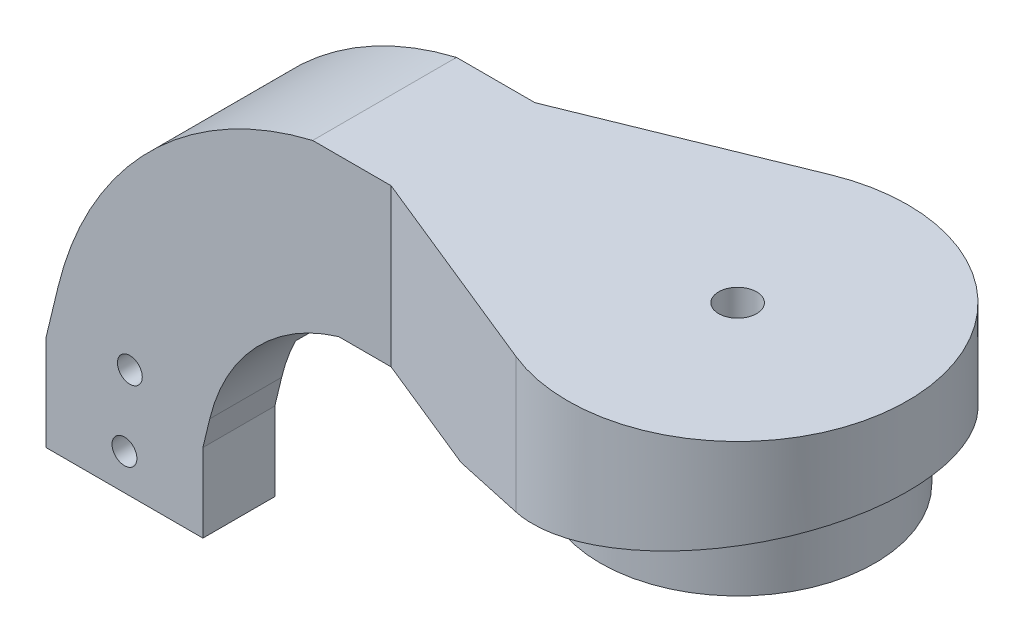
ISO-10303-21;
HEADER;
FILE_DESCRIPTION(('STEP AP214'),'2;1');
FILE_NAME('part.step','',(''),(''),'','','');
FILE_SCHEMA(('AUTOMOTIVE_DESIGN { 1 0 10303 214 1 1 1 1 }'));
ENDSEC;
DATA;
#1=APPLICATION_CONTEXT('core data for automotive mechanical design processes');
#2=APPLICATION_PROTOCOL_DEFINITION('international standard','automotive_design',2000,#1);
#3=PRODUCT_CONTEXT('',#1,'mechanical');
#4=PRODUCT('Part','Part','',(#3));
#5=PRODUCT_RELATED_PRODUCT_CATEGORY('part','',(#4));
#6=PRODUCT_DEFINITION_FORMATION('','',#4);
#7=PRODUCT_DEFINITION_CONTEXT('part definition',#1,'design');
#8=PRODUCT_DEFINITION('design','',#6,#7);
#9=PRODUCT_DEFINITION_SHAPE('','',#8);
#10=(LENGTH_UNIT() NAMED_UNIT(*) SI_UNIT(.MILLI.,.METRE.));
#11=(NAMED_UNIT(*) PLANE_ANGLE_UNIT() SI_UNIT($,.RADIAN.));
#12=(NAMED_UNIT(*) SI_UNIT($,.STERADIAN.) SOLID_ANGLE_UNIT());
#13=UNCERTAINTY_MEASURE_WITH_UNIT(LENGTH_MEASURE(1.E-05),#10,'distance_accuracy_value','');
#14=(GEOMETRIC_REPRESENTATION_CONTEXT(3) GLOBAL_UNCERTAINTY_ASSIGNED_CONTEXT((#13)) GLOBAL_UNIT_ASSIGNED_CONTEXT((#10,
#11,#12)) REPRESENTATION_CONTEXT('',''));
#15=CARTESIAN_POINT('',(0.,0.,0.));
#16=DIRECTION('',(0.,0.,1.));
#17=DIRECTION('',(1.,0.,0.));
#18=AXIS2_PLACEMENT_3D('',#15,#16,#17);
#19=CARTESIAN_POINT('',(-42.,24.,-11.));
#20=DIRECTION('',(0.376404535641537,0.,0.926455409368675));
#21=DIRECTION('',(0.,-1.,0.));
#22=AXIS2_PLACEMENT_3D('',#19,#20,#21);
#23=PLANE('',#22);
#24=DIRECTION('',(0.926455409368675,0.,-0.376404535641537));
#25=VECTOR('',#24,1.);
#26=CARTESIAN_POINT('',(-42.,0.,-11.));
#27=LINE('',#26,#25);
#28=CARTESIAN_POINT('',(-42.,0.,-11.));
#29=VERTEX_POINT('',#28);
#30=CARTESIAN_POINT('',(-24.,0.,-18.3131222215699));
#31=VERTEX_POINT('',#30);
#32=EDGE_CURVE('E433',#29,#31,#27,.T.);
#33=ORIENTED_EDGE('',*,*,#32,.F.);
#34=DIRECTION('',(0.,-1.,0.));
#35=VECTOR('',#34,1.);
#36=CARTESIAN_POINT('',(-42.,24.,-11.));
#37=LINE('',#36,#35);
#38=CARTESIAN_POINT('',(-42.,24.,-11.));
#39=VERTEX_POINT('',#38);
#40=EDGE_CURVE('E399',#39,#29,#37,.T.);
#41=ORIENTED_EDGE('',*,*,#40,.F.);
#42=DIRECTION('',(0.926455409368675,0.,-0.376404535641537));
#43=VECTOR('',#42,1.);
#44=CARTESIAN_POINT('',(-42.,24.,-11.));
#45=LINE('',#44,#43);
#46=CARTESIAN_POINT('',(-9.78651792667998,24.,-24.0878406435855));
#47=VERTEX_POINT('',#46);
#48=EDGE_CURVE('E367',#39,#47,#45,.T.);
#49=ORIENTED_EDGE('',*,*,#48,.T.);
#50=DIRECTION('',(0.,-1.,0.));
#51=VECTOR('',#50,1.);
#52=CARTESIAN_POINT('',(-9.78651792667998,24.,-24.0878406435855));
#53=LINE('',#52,#51);
#54=CARTESIAN_POINT('',(-9.78651792667998,3.41123569759681,-24.0878406435855));
#55=VERTEX_POINT('',#54);
#56=EDGE_CURVE('E59',#47,#55,#53,.T.);
#57=ORIENTED_EDGE('',*,*,#56,.T.);
#58=DIRECTION('',(0.904369439054215,0.217048665373012,-0.367431346736448));
#59=VECTOR('',#58,1.);
#60=CARTESIAN_POINT('',(-36.4410054694557,-2.98584131266939,-13.258533690606));
#61=LINE('',#60,#59);
#62=EDGE_CURVE('E330',#31,#55,#61,.T.);
#63=ORIENTED_EDGE('',*,*,#62,.F.);
#64=EDGE_LOOP('',(#33,#41,#49,#57,#63));
#65=FACE_BOUND('',#64,.T.);
#66=ADVANCED_FACE('F48',(#65),#23,.F.);
#67=CARTESIAN_POINT('',(0.,24.,0.));
#68=DIRECTION('',(0.,-1.,0.));
#69=DIRECTION('',(0.,0.,1.));
#70=AXIS2_PLACEMENT_3D('',#67,#68,#69);
#71=CYLINDRICAL_SURFACE('',#70,26.);
#72=ORIENTED_EDGE('',*,*,#56,.F.);
#73=CARTESIAN_POINT('',(0.,24.,0.));
#74=DIRECTION('',(0.,-1.,0.));
#75=DIRECTION('',(0.,0.,-1.));
#76=AXIS2_PLACEMENT_3D('',#73,#74,#75);
#77=CIRCLE('',#76,26.);
#78=CARTESIAN_POINT('',(-9.78651792667998,24.,24.0878406435855));
#79=VERTEX_POINT('',#78);
#80=EDGE_CURVE('E80',#47,#79,#77,.T.);
#81=ORIENTED_EDGE('',*,*,#80,.T.);
#82=DIRECTION('',(0.,-1.,0.));
#83=VECTOR('',#82,1.);
#84=CARTESIAN_POINT('',(-9.78651792667998,24.,24.0878406435855));
#85=LINE('',#84,#83);
#86=CARTESIAN_POINT('',(-9.78651792667997,3.41123569759681,24.0878406435855));
#87=VERTEX_POINT('',#86);
#88=EDGE_CURVE('E362',#79,#87,#85,.T.);
#89=ORIENTED_EDGE('',*,*,#88,.T.);
#90=CARTESIAN_POINT('',(0.,5.76,26.));
#91=CARTESIAN_POINT('',(-3.36549669401161,4.95228079343722,26.));
#92=CARTESIAN_POINT('',(-6.66853530930052,4.15955152576788,25.3546288638981));
#93=CARTESIAN_POINT('',(-9.78651792667997,3.41123569759681,24.0878406435855));
#94=(BOUNDED_CURVE() B_SPLINE_CURVE(3,(#90,#91,#92,#93),.UNSPECIFIED.,.F.,
.F.) B_SPLINE_CURVE_WITH_KNOTS((4,4),(4.71238898038469,5.09830132041736),
.UNSPECIFIED.) CURVE() GEOMETRIC_REPRESENTATION_ITEM() RATIONAL_B_SPLINE_CURVE((1.,
0.987627764061524,0.987627764061524,1.)) REPRESENTATION_ITEM(''));
#95=CARTESIAN_POINT('',(0.,5.76,26.));
#96=VERTEX_POINT('',#95);
#97=EDGE_CURVE('E768',#96,#87,#94,.T.);
#98=ORIENTED_EDGE('',*,*,#97,.F.);
#99=CARTESIAN_POINT('',(0.,5.76,-26.));
#100=CARTESIAN_POINT('',(52.,18.24,-26.));
#101=CARTESIAN_POINT('',(52.,18.24,26.));
#102=CARTESIAN_POINT('',(0.,5.76,26.));
#103=(BOUNDED_CURVE() B_SPLINE_CURVE(3,(#99,#100,#101,#102),.UNSPECIFIED.,.F.,
.F.) B_SPLINE_CURVE_WITH_KNOTS((4,4),(1.5707963267949,4.71238898038469),
.UNSPECIFIED.) CURVE() GEOMETRIC_REPRESENTATION_ITEM() RATIONAL_B_SPLINE_CURVE((1.,
0.333333333333334,0.333333333333334,1.)) REPRESENTATION_ITEM(''));
#104=CARTESIAN_POINT('',(0.,5.76,-26.));
#105=VERTEX_POINT('',#104);
#106=EDGE_CURVE('E52',#105,#96,#103,.T.);
#107=ORIENTED_EDGE('',*,*,#106,.F.);
#108=CARTESIAN_POINT('',(-9.78651792667998,3.41123569759681,-24.0878406435855));
#109=CARTESIAN_POINT('',(-6.66853530930053,4.15955152576788,-25.3546288638981));
#110=CARTESIAN_POINT('',(-3.36549669401162,4.95228079343722,-26.));
#111=CARTESIAN_POINT('',(0.,5.76,-26.));
#112=(BOUNDED_CURVE() B_SPLINE_CURVE(3,(#108,#109,#110,#111),.UNSPECIFIED.,.F.,
.F.) B_SPLINE_CURVE_WITH_KNOTS((4,4),(1.18488398676223,1.5707963267949),
.UNSPECIFIED.) CURVE() GEOMETRIC_REPRESENTATION_ITEM() RATIONAL_B_SPLINE_CURVE((1.,
0.987627764061524,0.987627764061524,1.)) REPRESENTATION_ITEM(''));
#113=EDGE_CURVE('E458',#55,#105,#112,.T.);
#114=ORIENTED_EDGE('',*,*,#113,.F.);
#115=EDGE_LOOP('',(#72,#81,#89,#98,#107,#114));
#116=FACE_BOUND('',#115,.T.);
#117=ADVANCED_FACE('F490',(#116),#71,.T.);
#118=CARTESIAN_POINT('',(-42.,24.,11.));
#119=DIRECTION('',(0.376404535641537,0.,-0.926455409368675));
#120=DIRECTION('',(0.,-1.,0.));
#121=AXIS2_PLACEMENT_3D('',#118,#119,#120);
#122=PLANE('',#121);
#123=ORIENTED_EDGE('',*,*,#88,.F.);
#124=DIRECTION('',(-0.926455409368675,0.,-0.376404535641537));
#125=VECTOR('',#124,1.);
#126=CARTESIAN_POINT('',(-42.,24.,11.));
#127=LINE('',#126,#125);
#128=CARTESIAN_POINT('',(-42.,24.,11.));
#129=VERTEX_POINT('',#128);
#130=EDGE_CURVE('E169',#79,#129,#127,.T.);
#131=ORIENTED_EDGE('',*,*,#130,.T.);
#132=DIRECTION('',(0.,-1.,0.));
#133=VECTOR('',#132,1.);
#134=CARTESIAN_POINT('',(-42.,24.,11.));
#135=LINE('',#134,#133);
#136=CARTESIAN_POINT('',(-42.,0.,11.));
#137=VERTEX_POINT('',#136);
#138=EDGE_CURVE('E276',#129,#137,#135,.T.);
#139=ORIENTED_EDGE('',*,*,#138,.T.);
#140=DIRECTION('',(-0.926455409368675,0.,-0.376404535641537));
#141=VECTOR('',#140,1.);
#142=CARTESIAN_POINT('',(-42.,0.,11.));
#143=LINE('',#142,#141);
#144=CARTESIAN_POINT('',(-24.,0.,18.3131222215699));
#145=VERTEX_POINT('',#144);
#146=EDGE_CURVE('E351',#145,#137,#143,.T.);
#147=ORIENTED_EDGE('',*,*,#146,.F.);
#148=DIRECTION('',(-0.904369439054215,-0.217048665373012,-0.367431346736448));
#149=VECTOR('',#148,1.);
#150=CARTESIAN_POINT('',(-36.4410054694557,-2.98584131266939,13.258533690606));
#151=LINE('',#150,#149);
#152=EDGE_CURVE('E454',#87,#145,#151,.T.);
#153=ORIENTED_EDGE('',*,*,#152,.F.);
#154=EDGE_LOOP('',(#123,#131,#139,#147,#153));
#155=FACE_BOUND('',#154,.T.);
#156=ADVANCED_FACE('F495',(#155),#122,.F.);
#157=CARTESIAN_POINT('',(0.,24.,0.));
#158=DIRECTION('',(0.,1.,0.));
#159=DIRECTION('',(1.,0.,0.));
#160=AXIS2_PLACEMENT_3D('',#157,#158,#159);
#161=PLANE('',#160);
#162=CARTESIAN_POINT('',(0.,24.,0.));
#163=DIRECTION('',(0.,-1.,0.));
#164=DIRECTION('',(0.,0.,-1.));
#165=AXIS2_PLACEMENT_3D('',#162,#163,#164);
#166=CIRCLE('',#165,2.89999999999999);
#167=CARTESIAN_POINT('',(0.,24.,-2.89999999999999));
#168=VERTEX_POINT('',#167);
#169=EDGE_CURVE('E563',#168,#168,#166,.T.);
#170=ORIENTED_EDGE('',*,*,#169,.T.);
#171=EDGE_LOOP('',(#170));
#172=FACE_BOUND('',#171,.T.);
#173=ORIENTED_EDGE('',*,*,#130,.F.);
#174=ORIENTED_EDGE('',*,*,#80,.F.);
#175=ORIENTED_EDGE('',*,*,#48,.F.);
#176=DIRECTION('',(-1.,0.,0.));
#177=VECTOR('',#176,1.);
#178=CARTESIAN_POINT('',(0.,24.,-11.));
#179=LINE('',#178,#177);
#180=CARTESIAN_POINT('',(-54.,24.,-11.));
#181=VERTEX_POINT('',#180);
#182=EDGE_CURVE('E343',#39,#181,#179,.T.);
#183=ORIENTED_EDGE('',*,*,#182,.T.);
#184=DIRECTION('',(0.,0.,1.));
#185=VECTOR('',#184,1.);
#186=CARTESIAN_POINT('',(-54.,24.,-11.));
#187=LINE('',#186,#185);
#188=CARTESIAN_POINT('',(-54.,24.,11.));
#189=VERTEX_POINT('',#188);
#190=EDGE_CURVE('E137',#181,#189,#187,.T.);
#191=ORIENTED_EDGE('',*,*,#190,.T.);
#192=DIRECTION('',(-1.,0.,0.));
#193=VECTOR('',#192,1.);
#194=CARTESIAN_POINT('',(0.,24.,11.));
#195=LINE('',#194,#193);
#196=EDGE_CURVE('E279',#129,#189,#195,.T.);
#197=ORIENTED_EDGE('',*,*,#196,.F.);
#198=EDGE_LOOP('',(#173,#174,#175,#183,#191,#197));
#199=FACE_BOUND('',#198,.T.);
#200=ADVANCED_FACE('F414',(#172,#199),#161,.T.);
#201=CARTESIAN_POINT('',(0.,0.,0.));
#202=DIRECTION('',(0.,1.,0.));
#203=DIRECTION('',(1.,0.,0.));
#204=AXIS2_PLACEMENT_3D('',#201,#202,#203);
#205=PLANE('',#204);
#206=ORIENTED_EDGE('',*,*,#146,.T.);
#207=DIRECTION('',(-1.,0.,0.));
#208=VECTOR('',#207,1.);
#209=CARTESIAN_POINT('',(0.,0.,11.));
#210=LINE('',#209,#208);
#211=CARTESIAN_POINT('',(-50.,0.,11.));
#212=VERTEX_POINT('',#211);
#213=EDGE_CURVE('E280',#137,#212,#210,.T.);
#214=ORIENTED_EDGE('',*,*,#213,.T.);
#215=DIRECTION('',(0.,0.,1.));
#216=VECTOR('',#215,1.);
#217=CARTESIAN_POINT('',(-50.,0.,-11.));
#218=LINE('',#217,#216);
#219=CARTESIAN_POINT('',(-50.,0.,-11.));
#220=VERTEX_POINT('',#219);
#221=EDGE_CURVE('E284',#220,#212,#218,.T.);
#222=ORIENTED_EDGE('',*,*,#221,.F.);
#223=DIRECTION('',(-1.,0.,0.));
#224=VECTOR('',#223,1.);
#225=CARTESIAN_POINT('',(0.,0.,-11.));
#226=LINE('',#225,#224);
#227=EDGE_CURVE('E342',#29,#220,#226,.T.);
#228=ORIENTED_EDGE('',*,*,#227,.F.);
#229=ORIENTED_EDGE('',*,*,#32,.T.);
#230=DIRECTION('',(0.,0.,-1.));
#231=VECTOR('',#230,1.);
#232=CARTESIAN_POINT('',(-24.,0.,0.));
#233=LINE('',#232,#231);
#234=EDGE_CURVE('E345',#145,#31,#233,.T.);
#235=ORIENTED_EDGE('',*,*,#234,.F.);
#236=EDGE_LOOP('',(#206,#214,#222,#228,#229,#235));
#237=FACE_BOUND('',#236,.T.);
#238=ADVANCED_FACE('F50',(#237),#205,.F.);
#239=CARTESIAN_POINT('',(-24.,0.,29.5));
#240=DIRECTION('',(-0.233372952475324,0.972387301980517,0.));
#241=DIRECTION('',(0.,0.,1.));
#242=AXIS2_PLACEMENT_3D('',#239,#240,#241);
#243=PLANE('',#242);
#244=CARTESIAN_POINT('',(0.,5.76,0.));
#245=DIRECTION('',(-0.233372952475324,0.972387301980517,0.));
#246=DIRECTION('',(-0.972387301980518,-0.233372952475324,0.));
#247=AXIS2_PLACEMENT_3D('',#244,#245,#246);
#248=ELLIPSE('',#247,21.5963330220665,21.);
#249=CARTESIAN_POINT('',(-21.,0.719999999999996,0.));
#250=VERTEX_POINT('',#249);
#251=EDGE_CURVE('E12',#250,#250,#248,.F.);
#252=ORIENTED_EDGE('',*,*,#251,.F.);
#253=EDGE_LOOP('',(#252));
#254=FACE_BOUND('',#253,.T.);
#255=ORIENTED_EDGE('',*,*,#234,.T.);
#256=ORIENTED_EDGE('',*,*,#62,.T.);
#257=ORIENTED_EDGE('',*,*,#113,.T.);
#258=ORIENTED_EDGE('',*,*,#106,.T.);
#259=ORIENTED_EDGE('',*,*,#97,.T.);
#260=ORIENTED_EDGE('',*,*,#152,.T.);
#261=EDGE_LOOP('',(#255,#256,#257,#258,#259,#260));
#262=FACE_BOUND('',#261,.T.);
#263=ADVANCED_FACE('F485',(#254,#262),#243,.F.);
#264=CARTESIAN_POINT('',(-41.7095894033961,-27.2551559973421,-11.));
#265=DIRECTION('',(0.,0.,1.));
#266=DIRECTION('',(-1.,0.,0.));
#267=AXIS2_PLACEMENT_3D('',#264,#265,#266);
#268=CYLINDRICAL_SURFACE('',#267,52.7081133123259);
#269=CARTESIAN_POINT('',(-41.7095894033961,-27.2551559973421,11.));
#270=DIRECTION('',(0.,0.,-1.));
#271=DIRECTION('',(1.,0.,0.));
#272=AXIS2_PLACEMENT_3D('',#269,#270,#271);
#273=CIRCLE('',#272,52.7081133123259);
#274=CARTESIAN_POINT('',(-92.9418253522618,-14.8695511019506,11.));
#275=VERTEX_POINT('',#274);
#276=EDGE_CURVE('E323',#275,#189,#273,.T.);
#277=ORIENTED_EDGE('',*,*,#276,.T.);
#278=ORIENTED_EDGE('',*,*,#190,.F.);
#279=CARTESIAN_POINT('',(-41.7095894033961,-27.2551559973421,-11.));
#280=DIRECTION('',(0.,0.,-1.));
#281=DIRECTION('',(1.,0.,0.));
#282=AXIS2_PLACEMENT_3D('',#279,#280,#281);
#283=CIRCLE('',#282,52.7081133123259);
#284=CARTESIAN_POINT('',(-92.9418253522618,-14.8695511019506,-11.));
#285=VERTEX_POINT('',#284);
#286=EDGE_CURVE('E418',#285,#181,#283,.T.);
#287=ORIENTED_EDGE('',*,*,#286,.F.);
#288=DIRECTION('',(0.,0.,1.));
#289=VECTOR('',#288,1.);
#290=CARTESIAN_POINT('',(-92.9418253522618,-14.8695511019506,-11.));
#291=LINE('',#290,#289);
#292=CARTESIAN_POINT('',(-92.9418253522618,-14.8695511019506,0.));
#293=VERTEX_POINT('',#292);
#294=EDGE_CURVE('E287',#285,#293,#291,.T.);
#295=ORIENTED_EDGE('',*,*,#294,.T.);
#296=DIRECTION('',(0.,0.,1.));
#297=VECTOR('',#296,1.);
#298=CARTESIAN_POINT('',(-92.9418253522618,-14.8695511019506,-11.));
#299=LINE('',#298,#297);
#300=EDGE_CURVE('E193',#293,#275,#299,.T.);
#301=ORIENTED_EDGE('',*,*,#300,.T.);
#302=EDGE_LOOP('',(#277,#278,#287,#295,#301));
#303=FACE_BOUND('',#302,.T.);
#304=ADVANCED_FACE('F477',(#303),#268,.T.);
#305=CARTESIAN_POINT('',(-84.4134977836503,20.4073121545938,-11.));
#306=DIRECTION('',(0.971999047761113,-0.234984789191746,0.));
#307=DIRECTION('',(0.,0.,-1.));
#308=AXIS2_PLACEMENT_3D('',#305,#306,#307);
#309=PLANE('',#308);
#310=DIRECTION('',(0.,0.,1.));
#311=VECTOR('',#310,1.);
#312=CARTESIAN_POINT('',(-94.78651792668,-22.5,-11.));
#313=LINE('',#312,#311);
#314=CARTESIAN_POINT('',(-94.78651792668,-22.5,0.));
#315=VERTEX_POINT('',#314);
#316=CARTESIAN_POINT('',(-94.78651792668,-22.5,11.));
#317=VERTEX_POINT('',#316);
#318=EDGE_CURVE('E149',#315,#317,#313,.T.);
#319=ORIENTED_EDGE('',*,*,#318,.T.);
#320=DIRECTION('',(-0.234984789191746,-0.971999047761113,0.));
#321=VECTOR('',#320,1.);
#322=CARTESIAN_POINT('',(-84.4134977836503,20.4073121545938,11.));
#323=LINE('',#322,#321);
#324=EDGE_CURVE('E328',#275,#317,#323,.T.);
#325=ORIENTED_EDGE('',*,*,#324,.F.);
#326=ORIENTED_EDGE('',*,*,#300,.F.);
#327=DIRECTION('',(-0.234984789191746,-0.971999047761113,0.));
#328=VECTOR('',#327,1.);
#329=CARTESIAN_POINT('',(-86.374058126423,12.2975838917223,0.));
#330=LINE('',#329,#328);
#331=EDGE_CURVE('E275',#293,#315,#330,.T.);
#332=ORIENTED_EDGE('',*,*,#331,.T.);
#333=EDGE_LOOP('',(#319,#325,#326,#332));
#334=FACE_BOUND('',#333,.T.);
#335=ADVANCED_FACE('F474',(#334),#309,.F.);
#336=CARTESIAN_POINT('',(-94.78651792668,0.,-11.));
#337=DIRECTION('',(1.,0.,0.));
#338=DIRECTION('',(0.,1.,0.));
#339=AXIS2_PLACEMENT_3D('',#336,#337,#338);
#340=PLANE('',#339);
#341=DIRECTION('',(0.,-1.,0.));
#342=VECTOR('',#341,1.);
#343=CARTESIAN_POINT('',(-94.78651792668,-14.8695511019506,0.));
#344=LINE('',#343,#342);
#345=CARTESIAN_POINT('',(-94.78651792668,-37.0753078944647,0.));
#346=VERTEX_POINT('',#345);
#347=EDGE_CURVE('E209',#315,#346,#344,.T.);
#348=ORIENTED_EDGE('',*,*,#347,.T.);
#349=DIRECTION('',(0.,0.,-1.));
#350=VECTOR('',#349,1.);
#351=CARTESIAN_POINT('',(-94.78651792668,-37.0753078944647,0.));
#352=LINE('',#351,#350);
#353=CARTESIAN_POINT('',(-94.78651792668,-37.0753078944647,11.));
#354=VERTEX_POINT('',#353);
#355=EDGE_CURVE('E265',#354,#346,#352,.T.);
#356=ORIENTED_EDGE('',*,*,#355,.F.);
#357=DIRECTION('',(0.,-1.,0.));
#358=VECTOR('',#357,1.);
#359=CARTESIAN_POINT('',(-94.78651792668,0.,11.));
#360=LINE('',#359,#358);
#361=EDGE_CURVE('E269',#317,#354,#360,.T.);
#362=ORIENTED_EDGE('',*,*,#361,.F.);
#363=ORIENTED_EDGE('',*,*,#318,.F.);
#364=EDGE_LOOP('',(#348,#356,#362,#363));
#365=FACE_BOUND('',#364,.T.);
#366=ADVANCED_FACE('F476',(#365),#340,.F.);
#367=CARTESIAN_POINT('',(-61.1505130339718,14.7833893946227,-11.));
#368=DIRECTION('',(0.971999047761113,-0.234984789191746,0.));
#369=DIRECTION('',(0.,0.,-1.));
#370=AXIS2_PLACEMENT_3D('',#367,#368,#369);
#371=PLANE('',#370);
#372=DIRECTION('',(-0.234984789191746,-0.971999047761113,0.));
#373=VECTOR('',#372,1.);
#374=CARTESIAN_POINT('',(-63.1110733767444,6.67366113175113,0.));
#375=LINE('',#374,#373);
#376=CARTESIAN_POINT('',(-69.7388628081069,-20.7417517475427,0.));
#377=VERTEX_POINT('',#376);
#378=CARTESIAN_POINT('',(-70.78651792668,-25.0753078944646,0.));
#379=VERTEX_POINT('',#378);
#380=EDGE_CURVE('E288',#377,#379,#375,.T.);
#381=ORIENTED_EDGE('',*,*,#380,.F.);
#382=DIRECTION('',(0.,0.,1.));
#383=VECTOR('',#382,1.);
#384=CARTESIAN_POINT('',(-69.7388628081069,-20.7417517475427,-11.));
#385=LINE('',#384,#383);
#386=CARTESIAN_POINT('',(-69.7388628081069,-20.7417517475427,11.));
#387=VERTEX_POINT('',#386);
#388=EDGE_CURVE('E281',#377,#387,#385,.T.);
#389=ORIENTED_EDGE('',*,*,#388,.T.);
#390=DIRECTION('',(-0.234984789191746,-0.971999047761113,0.));
#391=VECTOR('',#390,1.);
#392=CARTESIAN_POINT('',(-61.1505130339718,14.7833893946227,11.));
#393=LINE('',#392,#391);
#394=CARTESIAN_POINT('',(-70.78651792668,-25.0753078944646,11.));
#395=VERTEX_POINT('',#394);
#396=EDGE_CURVE('E391',#387,#395,#393,.T.);
#397=ORIENTED_EDGE('',*,*,#396,.T.);
#398=DIRECTION('',(0.,0.,1.));
#399=VECTOR('',#398,1.);
#400=CARTESIAN_POINT('',(-70.78651792668,-25.0753078944647,-11.));
#401=LINE('',#400,#399);
#402=EDGE_CURVE('E263',#379,#395,#401,.T.);
#403=ORIENTED_EDGE('',*,*,#402,.F.);
#404=EDGE_LOOP('',(#381,#389,#397,#403));
#405=FACE_BOUND('',#404,.T.);
#406=ADVANCED_FACE('F483',(#405),#371,.T.);
#407=CARTESIAN_POINT('',(-41.8993681465749,-27.4720647034177,-11.));
#408=DIRECTION('',(0.,0.,1.));
#409=DIRECTION('',(-1.,0.,0.));
#410=AXIS2_PLACEMENT_3D('',#407,#408,#409);
#411=CYLINDRICAL_SURFACE('',#410,28.6414834722905);
#412=CARTESIAN_POINT('',(-41.8993681465749,-27.4720647034177,-11.));
#413=DIRECTION('',(0.,0.,-1.));
#414=DIRECTION('',(1.,0.,0.));
#415=AXIS2_PLACEMENT_3D('',#412,#413,#414);
#416=CIRCLE('',#415,28.6414834722905);
#417=CARTESIAN_POINT('',(-67.6192286908766,-14.8695511019506,-11.));
#418=VERTEX_POINT('',#417);
#419=EDGE_CURVE('E336',#418,#220,#416,.T.);
#420=ORIENTED_EDGE('',*,*,#419,.T.);
#421=ORIENTED_EDGE('',*,*,#221,.T.);
#422=CARTESIAN_POINT('',(-41.8993681465749,-27.4720647034177,11.));
#423=DIRECTION('',(0.,0.,-1.));
#424=DIRECTION('',(1.,0.,0.));
#425=AXIS2_PLACEMENT_3D('',#422,#423,#424);
#426=CIRCLE('',#425,28.6414834722905);
#427=EDGE_CURVE('E394',#387,#212,#426,.T.);
#428=ORIENTED_EDGE('',*,*,#427,.F.);
#429=ORIENTED_EDGE('',*,*,#388,.F.);
#430=CARTESIAN_POINT('',(-41.8993681465749,-27.4720647034177,0.));
#431=DIRECTION('',(0.,0.,-1.));
#432=DIRECTION('',(-1.,0.,0.));
#433=AXIS2_PLACEMENT_3D('',#430,#431,#432);
#434=CIRCLE('',#433,28.6414834722905);
#435=CARTESIAN_POINT('',(-67.6192286908766,-14.8695511019506,0.));
#436=VERTEX_POINT('',#435);
#437=EDGE_CURVE('E390',#377,#436,#434,.T.);
#438=ORIENTED_EDGE('',*,*,#437,.T.);
#439=DIRECTION('',(0.,0.,-1.));
#440=VECTOR('',#439,1.);
#441=CARTESIAN_POINT('',(-67.6192286908766,-14.8695511019506,-11.));
#442=LINE('',#441,#440);
#443=EDGE_CURVE('E395',#436,#418,#442,.T.);
#444=ORIENTED_EDGE('',*,*,#443,.T.);
#445=EDGE_LOOP('',(#420,#421,#428,#429,#438,#444));
#446=FACE_BOUND('',#445,.T.);
#447=ADVANCED_FACE('F500',(#446),#411,.F.);
#448=CARTESIAN_POINT('',(0.,0.,-11.));
#449=DIRECTION('',(0.,0.,-1.));
#450=DIRECTION('',(0.,-1.,0.));
#451=AXIS2_PLACEMENT_3D('',#448,#449,#450);
#452=PLANE('',#451);
#453=DIRECTION('',(1.,0.,0.));
#454=VECTOR('',#453,1.);
#455=CARTESIAN_POINT('',(26.001,-14.8695511019506,-11.));
#456=LINE('',#455,#454);
#457=EDGE_CURVE('E372',#285,#418,#456,.T.);
#458=ORIENTED_EDGE('',*,*,#457,.F.);
#459=ORIENTED_EDGE('',*,*,#286,.T.);
#460=ORIENTED_EDGE('',*,*,#182,.F.);
#461=ORIENTED_EDGE('',*,*,#40,.T.);
#462=ORIENTED_EDGE('',*,*,#227,.T.);
#463=ORIENTED_EDGE('',*,*,#419,.F.);
#464=EDGE_LOOP('',(#458,#459,#460,#461,#462,#463));
#465=FACE_BOUND('',#464,.T.);
#466=ADVANCED_FACE('F420',(#465),#452,.T.);
#467=CARTESIAN_POINT('',(0.,0.,11.));
#468=DIRECTION('',(0.,0.,-1.));
#469=DIRECTION('',(0.,-1.,0.));
#470=AXIS2_PLACEMENT_3D('',#467,#468,#469);
#471=PLANE('',#470);
#472=CARTESIAN_POINT('',(-82.78651792668,-31.5753078944647,11.));
#473=DIRECTION('',(0.,0.,1.));
#474=DIRECTION('',(1.,0.,0.));
#475=AXIS2_PLACEMENT_3D('',#472,#473,#474);
#476=CIRCLE('',#475,1.89999999999999);
#477=CARTESIAN_POINT('',(-80.88651792668,-31.5753078944647,11.));
#478=VERTEX_POINT('',#477);
#479=EDGE_CURVE('E568',#478,#478,#476,.T.);
#480=ORIENTED_EDGE('',*,*,#479,.F.);
#481=EDGE_LOOP('',(#480));
#482=FACE_BOUND('',#481,.T.);
#483=CARTESIAN_POINT('',(-81.9601774293469,-20.3695511019507,11.));
#484=DIRECTION('',(0.,0.,1.));
#485=DIRECTION('',(1.,0.,0.));
#486=AXIS2_PLACEMENT_3D('',#483,#484,#485);
#487=CIRCLE('',#486,1.89999999999999);
#488=CARTESIAN_POINT('',(-80.0601774293469,-20.3695511019507,11.));
#489=VERTEX_POINT('',#488);
#490=EDGE_CURVE('E576',#489,#489,#487,.T.);
#491=ORIENTED_EDGE('',*,*,#490,.F.);
#492=EDGE_LOOP('',(#491));
#493=FACE_BOUND('',#492,.T.);
#494=ORIENTED_EDGE('',*,*,#361,.T.);
#495=DIRECTION('',(-1.,0.,0.));
#496=VECTOR('',#495,1.);
#497=CARTESIAN_POINT('',(-94.78651792668,-37.0753078944647,11.));
#498=LINE('',#497,#496);
#499=CARTESIAN_POINT('',(-70.78651792668,-37.0753078944647,11.));
#500=VERTEX_POINT('',#499);
#501=EDGE_CURVE('E258',#500,#354,#498,.T.);
#502=ORIENTED_EDGE('',*,*,#501,.F.);
#503=DIRECTION('',(0.,1.,0.));
#504=VECTOR('',#503,1.);
#505=CARTESIAN_POINT('',(-70.78651792668,-37.0753078944647,11.));
#506=LINE('',#505,#504);
#507=EDGE_CURVE('E201',#500,#395,#506,.T.);
#508=ORIENTED_EDGE('',*,*,#507,.T.);
#509=ORIENTED_EDGE('',*,*,#396,.F.);
#510=ORIENTED_EDGE('',*,*,#427,.T.);
#511=ORIENTED_EDGE('',*,*,#213,.F.);
#512=ORIENTED_EDGE('',*,*,#138,.F.);
#513=ORIENTED_EDGE('',*,*,#196,.T.);
#514=ORIENTED_EDGE('',*,*,#276,.F.);
#515=ORIENTED_EDGE('',*,*,#324,.T.);
#516=EDGE_LOOP('',(#494,#502,#508,#509,#510,#511,#512,#513,#514,#515));
#517=FACE_BOUND('',#516,.T.);
#518=ADVANCED_FACE('F267',(#482,#493,#517),#471,.F.);
#519=CARTESIAN_POINT('',(26.001,-14.8695511019506,-34.5150950819672));
#520=DIRECTION('',(0.,1.,0.));
#521=DIRECTION('',(0.,0.,-1.));
#522=AXIS2_PLACEMENT_3D('',#519,#520,#521);
#523=PLANE('',#522);
#524=ORIENTED_EDGE('',*,*,#294,.F.);
#525=ORIENTED_EDGE('',*,*,#457,.T.);
#526=ORIENTED_EDGE('',*,*,#443,.F.);
#527=DIRECTION('',(-1.,0.,0.));
#528=VECTOR('',#527,1.);
#529=CARTESIAN_POINT('',(26.001,-14.8695511019506,0.));
#530=LINE('',#529,#528);
#531=EDGE_CURVE('E292',#436,#293,#530,.T.);
#532=ORIENTED_EDGE('',*,*,#531,.T.);
#533=EDGE_LOOP('',(#524,#525,#526,#532));
#534=FACE_BOUND('',#533,.T.);
#535=ADVANCED_FACE('F507',(#534),#523,.F.);
#536=CARTESIAN_POINT('',(26.001,-14.8695511019506,0.));
#537=DIRECTION('',(0.,0.,1.));
#538=DIRECTION('',(1.,0.,0.));
#539=AXIS2_PLACEMENT_3D('',#536,#537,#538);
#540=PLANE('',#539);
#541=CARTESIAN_POINT('',(-82.78651792668,-31.5753078944647,0.));
#542=DIRECTION('',(0.,0.,1.));
#543=DIRECTION('',(1.,0.,0.));
#544=AXIS2_PLACEMENT_3D('',#541,#542,#543);
#545=CIRCLE('',#544,1.89999999999999);
#546=CARTESIAN_POINT('',(-80.88651792668,-31.5753078944647,0.));
#547=VERTEX_POINT('',#546);
#548=EDGE_CURVE('E573',#547,#547,#545,.T.);
#549=ORIENTED_EDGE('',*,*,#548,.T.);
#550=EDGE_LOOP('',(#549));
#551=FACE_BOUND('',#550,.T.);
#552=CARTESIAN_POINT('',(-81.9601774293469,-20.3695511019507,0.));
#553=DIRECTION('',(0.,0.,1.));
#554=DIRECTION('',(1.,0.,0.));
#555=AXIS2_PLACEMENT_3D('',#552,#553,#554);
#556=CIRCLE('',#555,1.89999999999999);
#557=CARTESIAN_POINT('',(-80.0601774293469,-20.3695511019507,0.));
#558=VERTEX_POINT('',#557);
#559=EDGE_CURVE('E579',#558,#558,#556,.T.);
#560=ORIENTED_EDGE('',*,*,#559,.T.);
#561=EDGE_LOOP('',(#560));
#562=FACE_BOUND('',#561,.T.);
#563=ORIENTED_EDGE('',*,*,#380,.T.);
#564=DIRECTION('',(0.,1.,0.));
#565=VECTOR('',#564,1.);
#566=CARTESIAN_POINT('',(-70.78651792668,-37.0753078944647,0.));
#567=LINE('',#566,#565);
#568=CARTESIAN_POINT('',(-70.78651792668,-37.0753078944647,0.));
#569=VERTEX_POINT('',#568);
#570=EDGE_CURVE('E222',#569,#379,#567,.T.);
#571=ORIENTED_EDGE('',*,*,#570,.F.);
#572=DIRECTION('',(1.,0.,0.));
#573=VECTOR('',#572,1.);
#574=CARTESIAN_POINT('',(-70.78651792668,-37.0753078944647,0.));
#575=LINE('',#574,#573);
#576=EDGE_CURVE('E260',#346,#569,#575,.T.);
#577=ORIENTED_EDGE('',*,*,#576,.F.);
#578=ORIENTED_EDGE('',*,*,#347,.F.);
#579=ORIENTED_EDGE('',*,*,#331,.F.);
#580=ORIENTED_EDGE('',*,*,#531,.F.);
#581=ORIENTED_EDGE('',*,*,#437,.F.);
#582=EDGE_LOOP('',(#563,#571,#577,#578,#579,#580,#581));
#583=FACE_BOUND('',#582,.T.);
#584=ADVANCED_FACE('F504',(#551,#562,#583),#540,.F.);
#585=CARTESIAN_POINT('',(-70.78651792668,-37.0753078944647,11.));
#586=DIRECTION('',(-1.,0.,0.));
#587=DIRECTION('',(0.,0.,1.));
#588=AXIS2_PLACEMENT_3D('',#585,#586,#587);
#589=PLANE('',#588);
#590=ORIENTED_EDGE('',*,*,#402,.T.);
#591=ORIENTED_EDGE('',*,*,#507,.F.);
#592=DIRECTION('',(0.,0.,1.));
#593=VECTOR('',#592,1.);
#594=CARTESIAN_POINT('',(-70.78651792668,-37.0753078944647,11.));
#595=LINE('',#594,#593);
#596=EDGE_CURVE('E256',#569,#500,#595,.T.);
#597=ORIENTED_EDGE('',*,*,#596,.F.);
#598=ORIENTED_EDGE('',*,*,#570,.T.);
#599=EDGE_LOOP('',(#590,#591,#597,#598));
#600=FACE_BOUND('',#599,.T.);
#601=ADVANCED_FACE('F262',(#600),#589,.F.);
#602=CARTESIAN_POINT('',(0.,-37.0753078944647,0.));
#603=DIRECTION('',(0.,1.,0.));
#604=DIRECTION('',(0.,0.,1.));
#605=AXIS2_PLACEMENT_3D('',#602,#603,#604);
#606=PLANE('',#605);
#607=ORIENTED_EDGE('',*,*,#576,.T.);
#608=ORIENTED_EDGE('',*,*,#596,.T.);
#609=ORIENTED_EDGE('',*,*,#501,.T.);
#610=ORIENTED_EDGE('',*,*,#355,.T.);
#611=EDGE_LOOP('',(#607,#608,#609,#610));
#612=FACE_BOUND('',#611,.T.);
#613=ADVANCED_FACE('F257',(#612),#606,.F.);
#614=CARTESIAN_POINT('',(0.,24.002,0.));
#615=DIRECTION('',(0.,-1.,0.));
#616=DIRECTION('',(0.,0.,-1.));
#617=AXIS2_PLACEMENT_3D('',#614,#615,#616);
#618=CYLINDRICAL_SURFACE('',#617,21.);
#619=CARTESIAN_POINT('',(0.,0.,0.));
#620=DIRECTION('',(0.,-1.,0.));
#621=DIRECTION('',(0.,0.,1.));
#622=AXIS2_PLACEMENT_3D('',#619,#620,#621);
#623=CIRCLE('',#622,21.);
#624=CARTESIAN_POINT('',(0.,0.,21.));
#625=VERTEX_POINT('',#624);
#626=EDGE_CURVE('E617',#625,#625,#623,.T.);
#627=ORIENTED_EDGE('',*,*,#626,.F.);
#628=EDGE_LOOP('',(#627));
#629=FACE_BOUND('',#628,.T.);
#630=ORIENTED_EDGE('',*,*,#251,.T.);
#631=EDGE_LOOP('',(#630));
#632=FACE_BOUND('',#631,.T.);
#633=ADVANCED_FACE('F513',(#629,#632),#618,.T.);
#634=CARTESIAN_POINT('',(0.,0.,0.));
#635=DIRECTION('',(0.,1.,0.));
#636=DIRECTION('',(0.,0.,1.));
#637=AXIS2_PLACEMENT_3D('',#634,#635,#636);
#638=PLANE('',#637);
#639=DIRECTION('',(1.,0.,0.));
#640=VECTOR('',#639,1.);
#641=CARTESIAN_POINT('',(-2.82901631902917,0.,-4.9));
#642=LINE('',#641,#640);
#643=CARTESIAN_POINT('',(-2.82901631902917,0.,-4.9));
#644=VERTEX_POINT('',#643);
#645=CARTESIAN_POINT('',(2.82901631902916,0.,-4.9));
#646=VERTEX_POINT('',#645);
#647=EDGE_CURVE('E603',#644,#646,#642,.T.);
#648=ORIENTED_EDGE('',*,*,#647,.F.);
#649=DIRECTION('',(0.499999999999999,0.,-0.866025403784439));
#650=VECTOR('',#649,1.);
#651=CARTESIAN_POINT('',(-5.65803263805833,0.,0.));
#652=LINE('',#651,#650);
#653=CARTESIAN_POINT('',(-5.65803263805833,0.,0.));
#654=VERTEX_POINT('',#653);
#655=EDGE_CURVE('E67',#654,#644,#652,.T.);
#656=ORIENTED_EDGE('',*,*,#655,.F.);
#657=DIRECTION('',(-0.5,0.,-0.866025403784439));
#658=VECTOR('',#657,1.);
#659=CARTESIAN_POINT('',(-2.82901631902916,0.,4.9));
#660=LINE('',#659,#658);
#661=CARTESIAN_POINT('',(-2.82901631902916,0.,4.9));
#662=VERTEX_POINT('',#661);
#663=EDGE_CURVE('E586',#662,#654,#660,.T.);
#664=ORIENTED_EDGE('',*,*,#663,.F.);
#665=DIRECTION('',(-1.,0.,0.));
#666=VECTOR('',#665,1.);
#667=CARTESIAN_POINT('',(2.82901631902916,0.,4.9));
#668=LINE('',#667,#666);
#669=CARTESIAN_POINT('',(2.82901631902916,0.,4.9));
#670=VERTEX_POINT('',#669);
#671=EDGE_CURVE('E612',#670,#662,#668,.T.);
#672=ORIENTED_EDGE('',*,*,#671,.F.);
#673=DIRECTION('',(-0.5,0.,0.866025403784439));
#674=VECTOR('',#673,1.);
#675=CARTESIAN_POINT('',(5.65803263805833,0.,0.));
#676=LINE('',#675,#674);
#677=CARTESIAN_POINT('',(5.65803263805833,0.,0.));
#678=VERTEX_POINT('',#677);
#679=EDGE_CURVE('E609',#678,#670,#676,.T.);
#680=ORIENTED_EDGE('',*,*,#679,.F.);
#681=DIRECTION('',(0.5,0.,0.866025403784439));
#682=VECTOR('',#681,1.);
#683=CARTESIAN_POINT('',(2.82901631902916,0.,-4.9));
#684=LINE('',#683,#682);
#685=EDGE_CURVE('E606',#646,#678,#684,.T.);
#686=ORIENTED_EDGE('',*,*,#685,.F.);
#687=EDGE_LOOP('',(#648,#656,#664,#672,#680,#686));
#688=FACE_BOUND('',#687,.T.);
#689=ORIENTED_EDGE('',*,*,#626,.T.);
#690=EDGE_LOOP('',(#689));
#691=FACE_BOUND('',#690,.T.);
#692=ADVANCED_FACE('F514',(#688,#691),#638,.F.);
#693=CARTESIAN_POINT('',(-5.65803263805833,4.,0.));
#694=DIRECTION('',(-0.866025403784439,0.,-0.499999999999999));
#695=DIRECTION('',(-0.499999999999999,0.,0.866025403784439));
#696=AXIS2_PLACEMENT_3D('',#693,#694,#695);
#697=PLANE('',#696);
#698=ORIENTED_EDGE('',*,*,#655,.T.);
#699=DIRECTION('',(0.,-1.,0.));
#700=VECTOR('',#699,1.);
#701=CARTESIAN_POINT('',(-2.82901631902917,4.,-4.9));
#702=LINE('',#701,#700);
#703=CARTESIAN_POINT('',(-2.82901631902917,4.,-4.9));
#704=VERTEX_POINT('',#703);
#705=EDGE_CURVE('E601',#704,#644,#702,.T.);
#706=ORIENTED_EDGE('',*,*,#705,.F.);
#707=DIRECTION('',(0.499999999999999,0.,-0.866025403784439));
#708=VECTOR('',#707,1.);
#709=CARTESIAN_POINT('',(-5.65803263805833,4.,0.));
#710=LINE('',#709,#708);
#711=CARTESIAN_POINT('',(-5.65803263805833,4.,0.));
#712=VERTEX_POINT('',#711);
#713=EDGE_CURVE('E582',#712,#704,#710,.T.);
#714=ORIENTED_EDGE('',*,*,#713,.F.);
#715=DIRECTION('',(0.,-1.,0.));
#716=VECTOR('',#715,1.);
#717=CARTESIAN_POINT('',(-5.65803263805833,4.,0.));
#718=LINE('',#717,#716);
#719=EDGE_CURVE('E231',#712,#654,#718,.T.);
#720=ORIENTED_EDGE('',*,*,#719,.T.);
#721=EDGE_LOOP('',(#698,#706,#714,#720));
#722=FACE_BOUND('',#721,.T.);
#723=ADVANCED_FACE('F518',(#722),#697,.F.);
#724=CARTESIAN_POINT('',(-2.82901631902916,4.,4.9));
#725=DIRECTION('',(-0.866025403784439,0.,0.5));
#726=DIRECTION('',(0.5,0.,0.866025403784439));
#727=AXIS2_PLACEMENT_3D('',#724,#725,#726);
#728=PLANE('',#727);
#729=ORIENTED_EDGE('',*,*,#663,.T.);
#730=ORIENTED_EDGE('',*,*,#719,.F.);
#731=DIRECTION('',(-0.5,0.,-0.866025403784439));
#732=VECTOR('',#731,1.);
#733=CARTESIAN_POINT('',(-2.82901631902916,4.,4.9));
#734=LINE('',#733,#732);
#735=CARTESIAN_POINT('',(-2.82901631902916,4.,4.9));
#736=VERTEX_POINT('',#735);
#737=EDGE_CURVE('E598',#736,#712,#734,.T.);
#738=ORIENTED_EDGE('',*,*,#737,.F.);
#739=DIRECTION('',(0.,-1.,0.));
#740=VECTOR('',#739,1.);
#741=CARTESIAN_POINT('',(-2.82901631902916,4.,4.9));
#742=LINE('',#741,#740);
#743=EDGE_CURVE('E618',#736,#662,#742,.T.);
#744=ORIENTED_EDGE('',*,*,#743,.T.);
#745=EDGE_LOOP('',(#729,#730,#738,#744));
#746=FACE_BOUND('',#745,.T.);
#747=ADVANCED_FACE('F524',(#746),#728,.F.);
#748=CARTESIAN_POINT('',(2.82901631902916,4.,4.9));
#749=DIRECTION('',(0.,0.,1.));
#750=DIRECTION('',(1.,0.,0.));
#751=AXIS2_PLACEMENT_3D('',#748,#749,#750);
#752=PLANE('',#751);
#753=ORIENTED_EDGE('',*,*,#671,.T.);
#754=ORIENTED_EDGE('',*,*,#743,.F.);
#755=DIRECTION('',(-1.,0.,0.));
#756=VECTOR('',#755,1.);
#757=CARTESIAN_POINT('',(2.82901631902916,4.,4.9));
#758=LINE('',#757,#756);
#759=CARTESIAN_POINT('',(2.82901631902916,4.,4.9));
#760=VERTEX_POINT('',#759);
#761=EDGE_CURVE('E595',#760,#736,#758,.T.);
#762=ORIENTED_EDGE('',*,*,#761,.F.);
#763=DIRECTION('',(0.,-1.,0.));
#764=VECTOR('',#763,1.);
#765=CARTESIAN_POINT('',(2.82901631902916,4.,4.9));
#766=LINE('',#765,#764);
#767=EDGE_CURVE('E620',#760,#670,#766,.T.);
#768=ORIENTED_EDGE('',*,*,#767,.T.);
#769=EDGE_LOOP('',(#753,#754,#762,#768));
#770=FACE_BOUND('',#769,.T.);
#771=ADVANCED_FACE('F537',(#770),#752,.F.);
#772=CARTESIAN_POINT('',(5.65803263805833,4.,0.));
#773=DIRECTION('',(0.866025403784439,0.,0.5));
#774=DIRECTION('',(0.5,0.,-0.866025403784439));
#775=AXIS2_PLACEMENT_3D('',#772,#773,#774);
#776=PLANE('',#775);
#777=ORIENTED_EDGE('',*,*,#679,.T.);
#778=ORIENTED_EDGE('',*,*,#767,.F.);
#779=DIRECTION('',(-0.5,0.,0.866025403784439));
#780=VECTOR('',#779,1.);
#781=CARTESIAN_POINT('',(5.65803263805833,4.,0.));
#782=LINE('',#781,#780);
#783=CARTESIAN_POINT('',(5.65803263805833,4.,0.));
#784=VERTEX_POINT('',#783);
#785=EDGE_CURVE('E592',#784,#760,#782,.T.);
#786=ORIENTED_EDGE('',*,*,#785,.F.);
#787=DIRECTION('',(0.,-1.,0.));
#788=VECTOR('',#787,1.);
#789=CARTESIAN_POINT('',(5.65803263805833,4.,0.));
#790=LINE('',#789,#788);
#791=EDGE_CURVE('E622',#784,#678,#790,.T.);
#792=ORIENTED_EDGE('',*,*,#791,.T.);
#793=EDGE_LOOP('',(#777,#778,#786,#792));
#794=FACE_BOUND('',#793,.T.);
#795=ADVANCED_FACE('F533',(#794),#776,.F.);
#796=CARTESIAN_POINT('',(2.82901631902916,4.,-4.9));
#797=DIRECTION('',(0.866025403784438,0.,-0.5));
#798=DIRECTION('',(-0.5,0.,-0.866025403784439));
#799=AXIS2_PLACEMENT_3D('',#796,#797,#798);
#800=PLANE('',#799);
#801=ORIENTED_EDGE('',*,*,#685,.T.);
#802=ORIENTED_EDGE('',*,*,#791,.F.);
#803=DIRECTION('',(0.5,0.,0.866025403784439));
#804=VECTOR('',#803,1.);
#805=CARTESIAN_POINT('',(2.82901631902916,4.,-4.9));
#806=LINE('',#805,#804);
#807=CARTESIAN_POINT('',(2.82901631902916,4.,-4.9));
#808=VERTEX_POINT('',#807);
#809=EDGE_CURVE('E589',#808,#784,#806,.T.);
#810=ORIENTED_EDGE('',*,*,#809,.F.);
#811=DIRECTION('',(0.,-1.,0.));
#812=VECTOR('',#811,1.);
#813=CARTESIAN_POINT('',(2.82901631902916,4.,-4.9));
#814=LINE('',#813,#812);
#815=EDGE_CURVE('E624',#808,#646,#814,.T.);
#816=ORIENTED_EDGE('',*,*,#815,.T.);
#817=EDGE_LOOP('',(#801,#802,#810,#816));
#818=FACE_BOUND('',#817,.T.);
#819=ADVANCED_FACE('F529',(#818),#800,.F.);
#820=CARTESIAN_POINT('',(-2.82901631902917,4.,-4.9));
#821=DIRECTION('',(0.,0.,-1.));
#822=DIRECTION('',(-1.,0.,0.));
#823=AXIS2_PLACEMENT_3D('',#820,#821,#822);
#824=PLANE('',#823);
#825=ORIENTED_EDGE('',*,*,#647,.T.);
#826=ORIENTED_EDGE('',*,*,#815,.F.);
#827=DIRECTION('',(1.,0.,0.));
#828=VECTOR('',#827,1.);
#829=CARTESIAN_POINT('',(-2.82901631902917,4.,-4.9));
#830=LINE('',#829,#828);
#831=EDGE_CURVE('E585',#704,#808,#830,.T.);
#832=ORIENTED_EDGE('',*,*,#831,.F.);
#833=ORIENTED_EDGE('',*,*,#705,.T.);
#834=EDGE_LOOP('',(#825,#826,#832,#833));
#835=FACE_BOUND('',#834,.T.);
#836=ADVANCED_FACE('F525',(#835),#824,.F.);
#837=CARTESIAN_POINT('',(0.,4.,0.));
#838=DIRECTION('',(0.,-1.,0.));
#839=DIRECTION('',(0.,0.,-1.));
#840=AXIS2_PLACEMENT_3D('',#837,#838,#839);
#841=PLANE('',#840);
#842=CARTESIAN_POINT('',(0.,4.,0.));
#843=DIRECTION('',(0.,-1.,0.));
#844=DIRECTION('',(0.,0.,-1.));
#845=AXIS2_PLACEMENT_3D('',#842,#843,#844);
#846=CIRCLE('',#845,2.89999999999999);
#847=CARTESIAN_POINT('',(0.,4.,-2.89999999999999));
#848=VERTEX_POINT('',#847);
#849=EDGE_CURVE('E566',#848,#848,#846,.T.);
#850=ORIENTED_EDGE('',*,*,#849,.F.);
#851=EDGE_LOOP('',(#850));
#852=FACE_BOUND('',#851,.T.);
#853=ORIENTED_EDGE('',*,*,#713,.T.);
#854=ORIENTED_EDGE('',*,*,#831,.T.);
#855=ORIENTED_EDGE('',*,*,#809,.T.);
#856=ORIENTED_EDGE('',*,*,#785,.T.);
#857=ORIENTED_EDGE('',*,*,#761,.T.);
#858=ORIENTED_EDGE('',*,*,#737,.T.);
#859=EDGE_LOOP('',(#853,#854,#855,#856,#857,#858));
#860=FACE_BOUND('',#859,.T.);
#861=ADVANCED_FACE('F528',(#852,#860),#841,.T.);
#862=CARTESIAN_POINT('',(-81.9601774293469,-20.3695511019507,11.));
#863=DIRECTION('',(0.,0.,1.));
#864=DIRECTION('',(1.,0.,0.));
#865=AXIS2_PLACEMENT_3D('',#862,#863,#864);
#866=CYLINDRICAL_SURFACE('',#865,1.89999999999999);
#867=ORIENTED_EDGE('',*,*,#490,.T.);
#868=EDGE_LOOP('',(#867));
#869=FACE_BOUND('',#868,.T.);
#870=ORIENTED_EDGE('',*,*,#559,.F.);
#871=EDGE_LOOP('',(#870));
#872=FACE_BOUND('',#871,.T.);
#873=ADVANCED_FACE('F546',(#869,#872),#866,.F.);
#874=CARTESIAN_POINT('',(-82.78651792668,-31.5753078944647,11.));
#875=DIRECTION('',(0.,0.,1.));
#876=DIRECTION('',(1.,0.,0.));
#877=AXIS2_PLACEMENT_3D('',#874,#875,#876);
#878=CYLINDRICAL_SURFACE('',#877,1.89999999999999);
#879=ORIENTED_EDGE('',*,*,#479,.T.);
#880=EDGE_LOOP('',(#879));
#881=FACE_BOUND('',#880,.T.);
#882=ORIENTED_EDGE('',*,*,#548,.F.);
#883=EDGE_LOOP('',(#882));
#884=FACE_BOUND('',#883,.T.);
#885=ADVANCED_FACE('F550',(#881,#884),#878,.F.);
#886=CARTESIAN_POINT('',(0.,4.,0.));
#887=DIRECTION('',(0.,-1.,0.));
#888=DIRECTION('',(0.,0.,-1.));
#889=AXIS2_PLACEMENT_3D('',#886,#887,#888);
#890=CYLINDRICAL_SURFACE('',#889,2.89999999999999);
#891=ORIENTED_EDGE('',*,*,#169,.F.);
#892=EDGE_LOOP('',(#891));
#893=FACE_BOUND('',#892,.T.);
#894=ORIENTED_EDGE('',*,*,#849,.T.);
#895=EDGE_LOOP('',(#894));
#896=FACE_BOUND('',#895,.T.);
#897=ADVANCED_FACE('F554',(#893,#896),#890,.F.);
#898=CLOSED_SHELL('',(#66,#117,#156,#200,#238,#263,#304,#335,#366,#406,#447,#466,#518,#535,#584,
#601,#613,#633,#692,#723,#747,#771,#795,#819,#836,#861,#873,#885,#897));
#899=MANIFOLD_SOLID_BREP('B2',#898);
#900=ADVANCED_BREP_SHAPE_REPRESENTATION('',(#18,#899),#14);
#901=SHAPE_DEFINITION_REPRESENTATION(#9,#900);
ENDSEC;
END-ISO-10303-21;
